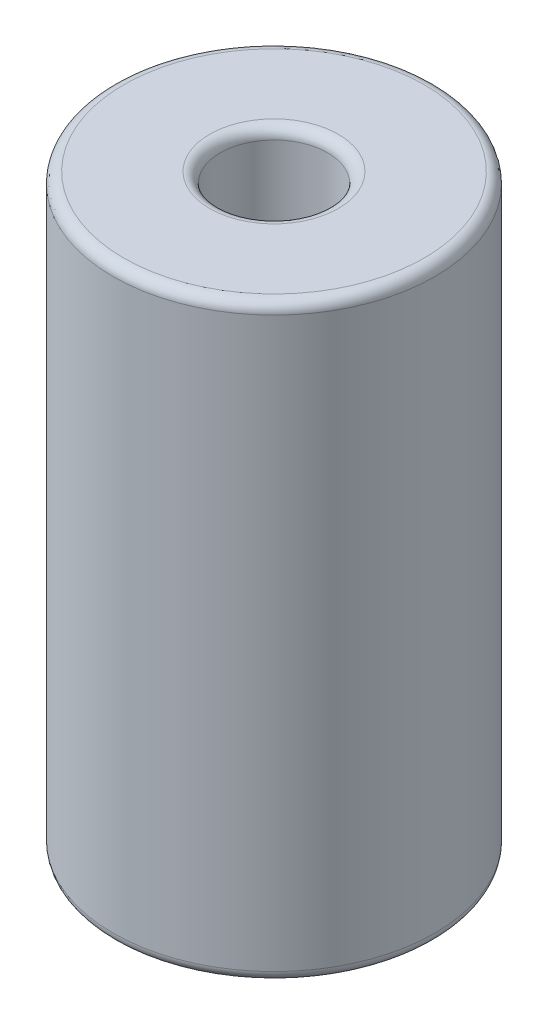
ISO-10303-21;
HEADER;
FILE_DESCRIPTION(('STEP AP214'),'2;1');
FILE_NAME('part.step','',(''),(''),'','','');
FILE_SCHEMA(('AUTOMOTIVE_DESIGN { 1 0 10303 214 1 1 1 1 }'));
ENDSEC;
DATA;
#1=APPLICATION_CONTEXT('core data for automotive mechanical design processes');
#2=APPLICATION_PROTOCOL_DEFINITION('international standard','automotive_design',2000,#1);
#3=PRODUCT_CONTEXT('',#1,'mechanical');
#4=PRODUCT('Part','Part','',(#3));
#5=PRODUCT_RELATED_PRODUCT_CATEGORY('part','',(#4));
#6=PRODUCT_DEFINITION_FORMATION('','',#4);
#7=PRODUCT_DEFINITION_CONTEXT('part definition',#1,'design');
#8=PRODUCT_DEFINITION('design','',#6,#7);
#9=PRODUCT_DEFINITION_SHAPE('','',#8);
#10=(LENGTH_UNIT() NAMED_UNIT(*) SI_UNIT(.MILLI.,.METRE.));
#11=(NAMED_UNIT(*) PLANE_ANGLE_UNIT() SI_UNIT($,.RADIAN.));
#12=(NAMED_UNIT(*) SI_UNIT($,.STERADIAN.) SOLID_ANGLE_UNIT());
#13=UNCERTAINTY_MEASURE_WITH_UNIT(LENGTH_MEASURE(1.E-05),#10,'distance_accuracy_value','');
#14=(GEOMETRIC_REPRESENTATION_CONTEXT(3) GLOBAL_UNCERTAINTY_ASSIGNED_CONTEXT((#13)) GLOBAL_UNIT_ASSIGNED_CONTEXT((#10,
#11,#12)) REPRESENTATION_CONTEXT('',''));
#15=CARTESIAN_POINT('',(0.,0.,0.));
#16=DIRECTION('',(0.,0.,1.));
#17=DIRECTION('',(1.,0.,0.));
#18=AXIS2_PLACEMENT_3D('',#15,#16,#17);
#19=CARTESIAN_POINT('',(0.,13.97,0.));
#20=DIRECTION('',(0.,1.,0.));
#21=DIRECTION('',(0.,0.,1.));
#22=AXIS2_PLACEMENT_3D('',#19,#20,#21);
#23=PLANE('',#22);
#24=CARTESIAN_POINT('',(0.,13.97,0.));
#25=DIRECTION('',(0.,1.,0.));
#26=DIRECTION('',(0.,0.,1.));
#27=AXIS2_PLACEMENT_3D('',#24,#25,#26);
#28=CIRCLE('',#27,1.524);
#29=CARTESIAN_POINT('',(0.,13.97,1.524));
#30=VERTEX_POINT('',#29);
#31=EDGE_CURVE('E52',#30,#30,#28,.F.);
#32=ORIENTED_EDGE('',*,*,#31,.T.);
#33=EDGE_LOOP('',(#32));
#34=FACE_BOUND('',#33,.T.);
#35=CARTESIAN_POINT('',(0.,13.97,0.));
#36=DIRECTION('',(0.,1.,0.));
#37=DIRECTION('',(0.,0.,1.));
#38=AXIS2_PLACEMENT_3D('',#35,#36,#37);
#39=CIRCLE('',#38,3.556);
#40=CARTESIAN_POINT('',(0.,13.97,3.556));
#41=VERTEX_POINT('',#40);
#42=EDGE_CURVE('E55',#41,#41,#39,.T.);
#43=ORIENTED_EDGE('',*,*,#42,.T.);
#44=EDGE_LOOP('',(#43));
#45=FACE_BOUND('',#44,.T.);
#46=ADVANCED_FACE('F32',(#34,#45),#23,.T.);
#47=CARTESIAN_POINT('',(0.,0.,0.));
#48=DIRECTION('',(0.,1.,0.));
#49=DIRECTION('',(0.,0.,1.));
#50=AXIS2_PLACEMENT_3D('',#47,#48,#49);
#51=PLANE('',#50);
#52=CARTESIAN_POINT('',(0.,0.,0.));
#53=DIRECTION('',(0.,1.,0.));
#54=DIRECTION('',(0.,0.,1.));
#55=AXIS2_PLACEMENT_3D('',#52,#53,#54);
#56=CIRCLE('',#55,1.524);
#57=CARTESIAN_POINT('',(0.,0.,1.524));
#58=VERTEX_POINT('',#57);
#59=EDGE_CURVE('E10',#58,#58,#56,.T.);
#60=ORIENTED_EDGE('',*,*,#59,.T.);
#61=EDGE_LOOP('',(#60));
#62=FACE_BOUND('',#61,.T.);
#63=CARTESIAN_POINT('',(0.,0.,0.));
#64=DIRECTION('',(0.,1.,0.));
#65=DIRECTION('',(0.,0.,1.));
#66=AXIS2_PLACEMENT_3D('',#63,#64,#65);
#67=CIRCLE('',#66,3.556);
#68=CARTESIAN_POINT('',(0.,0.,3.556));
#69=VERTEX_POINT('',#68);
#70=EDGE_CURVE('E39',#69,#69,#67,.F.);
#71=ORIENTED_EDGE('',*,*,#70,.T.);
#72=EDGE_LOOP('',(#71));
#73=FACE_BOUND('',#72,.T.);
#74=ADVANCED_FACE('F80',(#62,#73),#51,.F.);
#75=CARTESIAN_POINT('',(0.,13.97,0.));
#76=DIRECTION('',(0.,-1.,0.));
#77=DIRECTION('',(0.,0.,-1.));
#78=AXIS2_PLACEMENT_3D('',#75,#76,#77);
#79=CYLINDRICAL_SURFACE('',#78,3.81);
#80=CARTESIAN_POINT('',(0.,13.716,0.));
#81=DIRECTION('',(0.,1.,0.));
#82=DIRECTION('',(0.,0.,1.));
#83=AXIS2_PLACEMENT_3D('',#80,#81,#82);
#84=CIRCLE('',#83,3.81);
#85=CARTESIAN_POINT('',(0.,13.716,3.81));
#86=VERTEX_POINT('',#85);
#87=EDGE_CURVE('E43',#86,#86,#84,.F.);
#88=ORIENTED_EDGE('',*,*,#87,.T.);
#89=EDGE_LOOP('',(#88));
#90=FACE_BOUND('',#89,.T.);
#91=CARTESIAN_POINT('',(0.,0.254000000000001,0.));
#92=DIRECTION('',(0.,1.,0.));
#93=DIRECTION('',(0.,0.,1.));
#94=AXIS2_PLACEMENT_3D('',#91,#92,#93);
#95=CIRCLE('',#94,3.81);
#96=CARTESIAN_POINT('',(0.,0.254000000000001,3.81));
#97=VERTEX_POINT('',#96);
#98=EDGE_CURVE('E47',#97,#97,#95,.T.);
#99=ORIENTED_EDGE('',*,*,#98,.T.);
#100=EDGE_LOOP('',(#99));
#101=FACE_BOUND('',#100,.T.);
#102=ADVANCED_FACE('F86',(#90,#101),#79,.T.);
#103=CARTESIAN_POINT('',(0.,13.97,0.));
#104=DIRECTION('',(0.,-1.,0.));
#105=DIRECTION('',(0.,0.,-1.));
#106=AXIS2_PLACEMENT_3D('',#103,#104,#105);
#107=CYLINDRICAL_SURFACE('',#106,1.27);
#108=CARTESIAN_POINT('',(0.,13.716,0.));
#109=DIRECTION('',(0.,1.,0.));
#110=DIRECTION('',(0.,0.,1.));
#111=AXIS2_PLACEMENT_3D('',#108,#109,#110);
#112=CIRCLE('',#111,1.27);
#113=CARTESIAN_POINT('',(0.,13.716,1.27));
#114=VERTEX_POINT('',#113);
#115=EDGE_CURVE('E58',#114,#114,#112,.T.);
#116=ORIENTED_EDGE('',*,*,#115,.T.);
#117=EDGE_LOOP('',(#116));
#118=FACE_BOUND('',#117,.T.);
#119=CARTESIAN_POINT('',(0.,0.254000000000001,0.));
#120=DIRECTION('',(0.,1.,0.));
#121=DIRECTION('',(0.,0.,1.));
#122=AXIS2_PLACEMENT_3D('',#119,#120,#121);
#123=CIRCLE('',#122,1.27);
#124=CARTESIAN_POINT('',(0.,0.254000000000001,1.27));
#125=VERTEX_POINT('',#124);
#126=EDGE_CURVE('E61',#125,#125,#123,.F.);
#127=ORIENTED_EDGE('',*,*,#126,.T.);
#128=EDGE_LOOP('',(#127));
#129=FACE_BOUND('',#128,.T.);
#130=ADVANCED_FACE('F65',(#118,#129),#107,.F.);
#131=CARTESIAN_POINT('',(0.,13.716,0.));
#132=DIRECTION('',(0.,1.,0.));
#133=DIRECTION('',(0.,0.,1.));
#134=AXIS2_PLACEMENT_3D('',#131,#132,#133);
#135=TOROIDAL_SURFACE('',#134,1.524,0.254);
#136=ORIENTED_EDGE('',*,*,#31,.F.);
#137=EDGE_LOOP('',(#136));
#138=FACE_BOUND('',#137,.T.);
#139=ORIENTED_EDGE('',*,*,#115,.F.);
#140=EDGE_LOOP('',(#139));
#141=FACE_BOUND('',#140,.T.);
#142=ADVANCED_FACE('F76',(#138,#141),#135,.T.);
#143=CARTESIAN_POINT('',(0.,13.716,0.));
#144=DIRECTION('',(0.,1.,0.));
#145=DIRECTION('',(0.,0.,1.));
#146=AXIS2_PLACEMENT_3D('',#143,#144,#145);
#147=TOROIDAL_SURFACE('',#146,3.556,0.254);
#148=ORIENTED_EDGE('',*,*,#87,.F.);
#149=EDGE_LOOP('',(#148));
#150=FACE_BOUND('',#149,.T.);
#151=ORIENTED_EDGE('',*,*,#42,.F.);
#152=EDGE_LOOP('',(#151));
#153=FACE_BOUND('',#152,.T.);
#154=ADVANCED_FACE('F70',(#150,#153),#147,.T.);
#155=CARTESIAN_POINT('',(0.,0.254000000000001,0.));
#156=DIRECTION('',(0.,1.,0.));
#157=DIRECTION('',(0.,0.,1.));
#158=AXIS2_PLACEMENT_3D('',#155,#156,#157);
#159=TOROIDAL_SURFACE('',#158,1.524,0.254);
#160=ORIENTED_EDGE('',*,*,#126,.F.);
#161=EDGE_LOOP('',(#160));
#162=FACE_BOUND('',#161,.T.);
#163=ORIENTED_EDGE('',*,*,#59,.F.);
#164=EDGE_LOOP('',(#163));
#165=FACE_BOUND('',#164,.T.);
#166=ADVANCED_FACE('F67',(#162,#165),#159,.T.);
#167=CARTESIAN_POINT('',(0.,0.254000000000001,0.));
#168=DIRECTION('',(0.,1.,0.));
#169=DIRECTION('',(0.,0.,1.));
#170=AXIS2_PLACEMENT_3D('',#167,#168,#169);
#171=TOROIDAL_SURFACE('',#170,3.556,0.254);
#172=ORIENTED_EDGE('',*,*,#70,.F.);
#173=EDGE_LOOP('',(#172));
#174=FACE_BOUND('',#173,.T.);
#175=ORIENTED_EDGE('',*,*,#98,.F.);
#176=EDGE_LOOP('',(#175));
#177=FACE_BOUND('',#176,.T.);
#178=ADVANCED_FACE('F34',(#174,#177),#171,.T.);
#179=CLOSED_SHELL('',(#46,#74,#102,#130,#142,#154,#166,#178));
#180=MANIFOLD_SOLID_BREP('B2',#179);
#181=ADVANCED_BREP_SHAPE_REPRESENTATION('',(#18,#180),#14);
#182=SHAPE_DEFINITION_REPRESENTATION(#9,#181);
ENDSEC;
END-ISO-10303-21;
